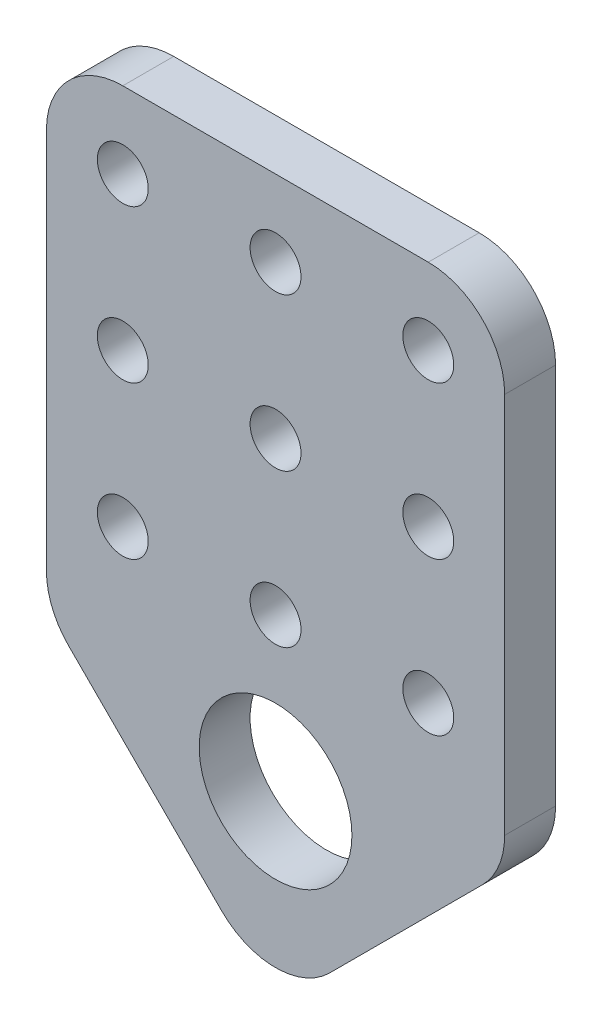
ISO-10303-21;
HEADER;
FILE_DESCRIPTION(('STEP AP214'),'2;1');
FILE_NAME('part.step','',(''),(''),'','','');
FILE_SCHEMA(('AUTOMOTIVE_DESIGN { 1 0 10303 214 1 1 1 1 }'));
ENDSEC;
DATA;
#1=APPLICATION_CONTEXT('core data for automotive mechanical design processes');
#2=APPLICATION_PROTOCOL_DEFINITION('international standard','automotive_design',2000,#1);
#3=PRODUCT_CONTEXT('',#1,'mechanical');
#4=PRODUCT('Part','Part','',(#3));
#5=PRODUCT_RELATED_PRODUCT_CATEGORY('part','',(#4));
#6=PRODUCT_DEFINITION_FORMATION('','',#4);
#7=PRODUCT_DEFINITION_CONTEXT('part definition',#1,'design');
#8=PRODUCT_DEFINITION('design','',#6,#7);
#9=PRODUCT_DEFINITION_SHAPE('','',#8);
#10=(LENGTH_UNIT() NAMED_UNIT(*) SI_UNIT(.MILLI.,.METRE.));
#11=(NAMED_UNIT(*) PLANE_ANGLE_UNIT() SI_UNIT($,.RADIAN.));
#12=(NAMED_UNIT(*) SI_UNIT($,.STERADIAN.) SOLID_ANGLE_UNIT());
#13=UNCERTAINTY_MEASURE_WITH_UNIT(LENGTH_MEASURE(1.E-05),#10,'distance_accuracy_value','');
#14=(GEOMETRIC_REPRESENTATION_CONTEXT(3) GLOBAL_UNCERTAINTY_ASSIGNED_CONTEXT((#13)) GLOBAL_UNIT_ASSIGNED_CONTEXT((#10,
#11,#12)) REPRESENTATION_CONTEXT('',''));
#15=CARTESIAN_POINT('',(0.,0.,0.));
#16=DIRECTION('',(0.,0.,1.));
#17=DIRECTION('',(1.,0.,0.));
#18=AXIS2_PLACEMENT_3D('',#15,#16,#17);
#19=CARTESIAN_POINT('',(0.,226.6787200631,3.));
#20=DIRECTION('',(0.,-1.,0.));
#21=DIRECTION('',(0.,0.,-1.));
#22=AXIS2_PLACEMENT_3D('',#19,#20,#21);
#23=PLANE('',#22);
#24=DIRECTION('',(-1.,0.,0.));
#25=VECTOR('',#24,1.);
#26=CARTESIAN_POINT('',(0.,226.6787200631,0.));
#27=LINE('',#26,#25);
#28=CARTESIAN_POINT('',(196.7270545748,226.6787200631,0.));
#29=VERTEX_POINT('',#28);
#30=CARTESIAN_POINT('',(178.7270545748,226.6787200631,0.));
#31=VERTEX_POINT('',#30);
#32=EDGE_CURVE('E171',#29,#31,#27,.T.);
#33=ORIENTED_EDGE('',*,*,#32,.T.);
#34=DIRECTION('',(0.,0.,-1.));
#35=VECTOR('',#34,1.);
#36=CARTESIAN_POINT('',(178.7270545748,226.6787200631,3.));
#37=LINE('',#36,#35);
#38=CARTESIAN_POINT('',(178.7270545748,226.6787200631,3.));
#39=VERTEX_POINT('',#38);
#40=EDGE_CURVE('E11',#39,#31,#37,.T.);
#41=ORIENTED_EDGE('',*,*,#40,.F.);
#42=DIRECTION('',(-1.,0.,0.));
#43=VECTOR('',#42,1.);
#44=CARTESIAN_POINT('',(0.,226.6787200631,3.));
#45=LINE('',#44,#43);
#46=CARTESIAN_POINT('',(196.7270545748,226.6787200631,3.));
#47=VERTEX_POINT('',#46);
#48=EDGE_CURVE('E230',#47,#39,#45,.T.);
#49=ORIENTED_EDGE('',*,*,#48,.F.);
#50=DIRECTION('',(0.,0.,-1.));
#51=VECTOR('',#50,1.);
#52=CARTESIAN_POINT('',(196.7270545748,226.6787200631,3.));
#53=LINE('',#52,#51);
#54=EDGE_CURVE('E137',#47,#29,#53,.T.);
#55=ORIENTED_EDGE('',*,*,#54,.T.);
#56=EDGE_LOOP('',(#33,#41,#49,#55));
#57=FACE_BOUND('',#56,.T.);
#58=ADVANCED_FACE('F33',(#57),#23,.F.);
#59=CARTESIAN_POINT('',(178.7270545748,222.1787200631,3.));
#60=DIRECTION('',(0.,0.,-1.));
#61=DIRECTION('',(-1.,0.,0.));
#62=AXIS2_PLACEMENT_3D('',#59,#60,#61);
#63=CYLINDRICAL_SURFACE('',#62,4.5);
#64=CARTESIAN_POINT('',(178.7270545748,222.1787200631,0.));
#65=DIRECTION('',(0.,0.,1.));
#66=DIRECTION('',(1.,0.,0.));
#67=AXIS2_PLACEMENT_3D('',#64,#65,#66);
#68=CIRCLE('',#67,4.5);
#69=CARTESIAN_POINT('',(174.2270545748,222.1787200631,0.));
#70=VERTEX_POINT('',#69);
#71=EDGE_CURVE('E174',#31,#70,#68,.T.);
#72=ORIENTED_EDGE('',*,*,#71,.T.);
#73=DIRECTION('',(0.,0.,-1.));
#74=VECTOR('',#73,1.);
#75=CARTESIAN_POINT('',(174.2270545748,222.1787200631,3.));
#76=LINE('',#75,#74);
#77=CARTESIAN_POINT('',(174.2270545748,222.1787200631,3.));
#78=VERTEX_POINT('',#77);
#79=EDGE_CURVE('E42',#78,#70,#76,.T.);
#80=ORIENTED_EDGE('',*,*,#79,.F.);
#81=CARTESIAN_POINT('',(178.7270545748,222.1787200631,3.));
#82=DIRECTION('',(0.,0.,1.));
#83=DIRECTION('',(1.,0.,0.));
#84=AXIS2_PLACEMENT_3D('',#81,#82,#83);
#85=CIRCLE('',#84,4.5);
#86=EDGE_CURVE('E95',#39,#78,#85,.T.);
#87=ORIENTED_EDGE('',*,*,#86,.F.);
#88=ORIENTED_EDGE('',*,*,#40,.T.);
#89=EDGE_LOOP('',(#72,#80,#87,#88));
#90=FACE_BOUND('',#89,.T.);
#91=ADVANCED_FACE('F212',(#90),#63,.T.);
#92=CARTESIAN_POINT('',(174.2270545748,0.,3.));
#93=DIRECTION('',(-1.,0.,0.));
#94=DIRECTION('',(0.,0.,1.));
#95=AXIS2_PLACEMENT_3D('',#92,#93,#94);
#96=PLANE('',#95);
#97=DIRECTION('',(0.,1.,0.));
#98=VECTOR('',#97,1.);
#99=CARTESIAN_POINT('',(174.2270545748,0.,0.));
#100=LINE('',#99,#98);
#101=CARTESIAN_POINT('',(174.2270545748,199.6787200631,0.));
#102=VERTEX_POINT('',#101);
#103=EDGE_CURVE('E177',#102,#70,#100,.T.);
#104=ORIENTED_EDGE('',*,*,#103,.F.);
#105=DIRECTION('',(0.,0.,-1.));
#106=VECTOR('',#105,1.);
#107=CARTESIAN_POINT('',(174.2270545748,199.6787200631,3.));
#108=LINE('',#107,#106);
#109=CARTESIAN_POINT('',(174.2270545748,199.6787200631,3.));
#110=VERTEX_POINT('',#109);
#111=EDGE_CURVE('E205',#110,#102,#108,.T.);
#112=ORIENTED_EDGE('',*,*,#111,.F.);
#113=DIRECTION('',(0.,1.,0.));
#114=VECTOR('',#113,1.);
#115=CARTESIAN_POINT('',(174.2270545748,0.,3.));
#116=LINE('',#115,#114);
#117=EDGE_CURVE('E211',#110,#78,#116,.T.);
#118=ORIENTED_EDGE('',*,*,#117,.T.);
#119=ORIENTED_EDGE('',*,*,#79,.T.);
#120=EDGE_LOOP('',(#104,#112,#118,#119));
#121=FACE_BOUND('',#120,.T.);
#122=ADVANCED_FACE('F209',(#121),#96,.T.);
#123=CARTESIAN_POINT('',(178.7270545748,199.678720062979,3.));
#124=DIRECTION('',(0.,0.,-1.));
#125=DIRECTION('',(-1.,0.,0.));
#126=AXIS2_PLACEMENT_3D('',#123,#124,#125);
#127=CYLINDRICAL_SURFACE('',#126,4.50000000000001);
#128=CARTESIAN_POINT('',(178.7270545748,199.678720062979,0.));
#129=DIRECTION('',(0.,0.,1.));
#130=DIRECTION('',(1.,0.,0.));
#131=AXIS2_PLACEMENT_3D('',#128,#129,#130);
#132=CIRCLE('',#131,4.50000000000001);
#133=CARTESIAN_POINT('',(175.5450740594,196.4967395477,0.));
#134=VERTEX_POINT('',#133);
#135=EDGE_CURVE('E180',#102,#134,#132,.T.);
#136=ORIENTED_EDGE('',*,*,#135,.T.);
#137=DIRECTION('',(0.,0.,-1.));
#138=VECTOR('',#137,1.);
#139=CARTESIAN_POINT('',(175.5450740594,196.4967395477,3.));
#140=LINE('',#139,#138);
#141=CARTESIAN_POINT('',(175.5450740594,196.4967395477,3.));
#142=VERTEX_POINT('',#141);
#143=EDGE_CURVE('E203',#142,#134,#140,.T.);
#144=ORIENTED_EDGE('',*,*,#143,.F.);
#145=CARTESIAN_POINT('',(178.7270545748,199.678720062979,3.));
#146=DIRECTION('',(0.,0.,1.));
#147=DIRECTION('',(1.,0.,0.));
#148=AXIS2_PLACEMENT_3D('',#145,#146,#147);
#149=CIRCLE('',#148,4.50000000000001);
#150=EDGE_CURVE('E225',#110,#142,#149,.T.);
#151=ORIENTED_EDGE('',*,*,#150,.F.);
#152=ORIENTED_EDGE('',*,*,#111,.T.);
#153=EDGE_LOOP('',(#136,#144,#151,#152));
#154=FACE_BOUND('',#153,.T.);
#155=ADVANCED_FACE('F222',(#154),#127,.T.);
#156=CARTESIAN_POINT('',(186.02090680355,186.02090680355,3.));
#157=DIRECTION('',(-0.707106781186546,-0.707106781186548,0.));
#158=DIRECTION('',(0.707106781186549,-0.707106781186546,0.));
#159=AXIS2_PLACEMENT_3D('',#156,#157,#158);
#160=PLANE('',#159);
#161=DIRECTION('',(-0.707106781186549,0.707106781186546,0.));
#162=VECTOR('',#161,1.);
#163=CARTESIAN_POINT('',(186.02090680355,186.02090680355,0.));
#164=LINE('',#163,#162);
#165=CARTESIAN_POINT('',(184.5450740594,187.4967395477,0.));
#166=VERTEX_POINT('',#165);
#167=EDGE_CURVE('E183',#166,#134,#164,.T.);
#168=ORIENTED_EDGE('',*,*,#167,.F.);
#169=DIRECTION('',(0.,0.,-1.));
#170=VECTOR('',#169,1.);
#171=CARTESIAN_POINT('',(184.5450740594,187.4967395477,3.));
#172=LINE('',#171,#170);
#173=CARTESIAN_POINT('',(184.5450740594,187.4967395477,3.));
#174=VERTEX_POINT('',#173);
#175=EDGE_CURVE('E201',#174,#166,#172,.T.);
#176=ORIENTED_EDGE('',*,*,#175,.F.);
#177=DIRECTION('',(-0.707106781186549,0.707106781186546,0.));
#178=VECTOR('',#177,1.);
#179=CARTESIAN_POINT('',(186.02090680355,186.02090680355,3.));
#180=LINE('',#179,#178);
#181=EDGE_CURVE('E227',#174,#142,#180,.T.);
#182=ORIENTED_EDGE('',*,*,#181,.T.);
#183=ORIENTED_EDGE('',*,*,#143,.T.);
#184=EDGE_LOOP('',(#168,#176,#182,#183));
#185=FACE_BOUND('',#184,.T.);
#186=ADVANCED_FACE('F436',(#185),#160,.T.);
#187=CARTESIAN_POINT('',(187.72705457475,190.678720063029,3.));
#188=DIRECTION('',(0.,0.,-1.));
#189=DIRECTION('',(-1.,0.,0.));
#190=AXIS2_PLACEMENT_3D('',#187,#188,#189);
#191=CYLINDRICAL_SURFACE('',#190,4.49999999999998);
#192=CARTESIAN_POINT('',(187.72705457475,190.678720063029,0.));
#193=DIRECTION('',(0.,0.,1.));
#194=DIRECTION('',(1.,0.,0.));
#195=AXIS2_PLACEMENT_3D('',#192,#193,#194);
#196=CIRCLE('',#195,4.49999999999998);
#197=CARTESIAN_POINT('',(190.9090350901,187.4967395477,0.));
#198=VERTEX_POINT('',#197);
#199=EDGE_CURVE('E186',#166,#198,#196,.T.);
#200=ORIENTED_EDGE('',*,*,#199,.T.);
#201=DIRECTION('',(0.,0.,-1.));
#202=VECTOR('',#201,1.);
#203=CARTESIAN_POINT('',(190.9090350901,187.4967395477,3.));
#204=LINE('',#203,#202);
#205=CARTESIAN_POINT('',(190.9090350901,187.4967395477,3.));
#206=VERTEX_POINT('',#205);
#207=EDGE_CURVE('E198',#206,#198,#204,.T.);
#208=ORIENTED_EDGE('',*,*,#207,.F.);
#209=CARTESIAN_POINT('',(187.72705457475,190.678720063029,3.));
#210=DIRECTION('',(0.,0.,1.));
#211=DIRECTION('',(1.,0.,0.));
#212=AXIS2_PLACEMENT_3D('',#209,#210,#211);
#213=CIRCLE('',#212,4.49999999999998);
#214=EDGE_CURVE('E235',#174,#206,#213,.T.);
#215=ORIENTED_EDGE('',*,*,#214,.F.);
#216=ORIENTED_EDGE('',*,*,#175,.T.);
#217=EDGE_LOOP('',(#200,#208,#215,#216));
#218=FACE_BOUND('',#217,.T.);
#219=ADVANCED_FACE('F239',(#218),#191,.T.);
#220=CARTESIAN_POINT('',(1.70614777119971,-1.70614777119971,3.));
#221=DIRECTION('',(-0.707106781186546,0.707106781186548,0.));
#222=DIRECTION('',(-0.707106781186549,-0.707106781186546,0.));
#223=AXIS2_PLACEMENT_3D('',#220,#221,#222);
#224=PLANE('',#223);
#225=DIRECTION('',(0.707106781186549,0.707106781186546,0.));
#226=VECTOR('',#225,1.);
#227=CARTESIAN_POINT('',(1.70614777119971,-1.70614777119971,0.));
#228=LINE('',#227,#226);
#229=CARTESIAN_POINT('',(199.9090350901,196.4967395477,0.));
#230=VERTEX_POINT('',#229);
#231=EDGE_CURVE('E188',#198,#230,#228,.T.);
#232=ORIENTED_EDGE('',*,*,#231,.T.);
#233=DIRECTION('',(0.,0.,-1.));
#234=VECTOR('',#233,1.);
#235=CARTESIAN_POINT('',(199.9090350901,196.4967395477,3.));
#236=LINE('',#235,#234);
#237=CARTESIAN_POINT('',(199.9090350901,196.4967395477,3.));
#238=VERTEX_POINT('',#237);
#239=EDGE_CURVE('E133',#238,#230,#236,.T.);
#240=ORIENTED_EDGE('',*,*,#239,.F.);
#241=DIRECTION('',(0.707106781186549,0.707106781186546,0.));
#242=VECTOR('',#241,1.);
#243=CARTESIAN_POINT('',(1.70614777119971,-1.70614777119971,3.));
#244=LINE('',#243,#242);
#245=EDGE_CURVE('E120',#206,#238,#244,.T.);
#246=ORIENTED_EDGE('',*,*,#245,.F.);
#247=ORIENTED_EDGE('',*,*,#207,.T.);
#248=EDGE_LOOP('',(#232,#240,#246,#247));
#249=FACE_BOUND('',#248,.T.);
#250=ADVANCED_FACE('F242',(#249),#224,.F.);
#251=CARTESIAN_POINT('',(196.7270545748,199.678720063079,3.));
#252=DIRECTION('',(0.,0.,-1.));
#253=DIRECTION('',(-1.,0.,0.));
#254=AXIS2_PLACEMENT_3D('',#251,#252,#253);
#255=CYLINDRICAL_SURFACE('',#254,4.50000000000001);
#256=CARTESIAN_POINT('',(196.7270545748,199.678720063079,0.));
#257=DIRECTION('',(0.,0.,1.));
#258=DIRECTION('',(1.,0.,0.));
#259=AXIS2_PLACEMENT_3D('',#256,#257,#258);
#260=CIRCLE('',#259,4.50000000000001);
#261=CARTESIAN_POINT('',(201.2270545748,199.6787200631,0.));
#262=VERTEX_POINT('',#261);
#263=EDGE_CURVE('E129',#230,#262,#260,.T.);
#264=ORIENTED_EDGE('',*,*,#263,.T.);
#265=DIRECTION('',(0.,0.,-1.));
#266=VECTOR('',#265,1.);
#267=CARTESIAN_POINT('',(201.2270545748,199.6787200631,3.));
#268=LINE('',#267,#266);
#269=CARTESIAN_POINT('',(201.2270545748,199.6787200631,3.));
#270=VERTEX_POINT('',#269);
#271=EDGE_CURVE('E126',#270,#262,#268,.T.);
#272=ORIENTED_EDGE('',*,*,#271,.F.);
#273=CARTESIAN_POINT('',(196.7270545748,199.678720063079,3.));
#274=DIRECTION('',(0.,0.,1.));
#275=DIRECTION('',(1.,0.,0.));
#276=AXIS2_PLACEMENT_3D('',#273,#274,#275);
#277=CIRCLE('',#276,4.50000000000001);
#278=EDGE_CURVE('E114',#238,#270,#277,.T.);
#279=ORIENTED_EDGE('',*,*,#278,.F.);
#280=ORIENTED_EDGE('',*,*,#239,.T.);
#281=EDGE_LOOP('',(#264,#272,#279,#280));
#282=FACE_BOUND('',#281,.T.);
#283=ADVANCED_FACE('F127',(#282),#255,.T.);
#284=CARTESIAN_POINT('',(201.2270545748,0.,3.));
#285=DIRECTION('',(1.,0.,0.));
#286=DIRECTION('',(0.,0.,-1.));
#287=AXIS2_PLACEMENT_3D('',#284,#285,#286);
#288=PLANE('',#287);
#289=DIRECTION('',(0.,-1.,0.));
#290=VECTOR('',#289,1.);
#291=CARTESIAN_POINT('',(201.2270545748,0.,0.));
#292=LINE('',#291,#290);
#293=CARTESIAN_POINT('',(201.2270545748,222.1787200631,0.));
#294=VERTEX_POINT('',#293);
#295=EDGE_CURVE('E191',#294,#262,#292,.T.);
#296=ORIENTED_EDGE('',*,*,#295,.F.);
#297=DIRECTION('',(0.,0.,-1.));
#298=VECTOR('',#297,1.);
#299=CARTESIAN_POINT('',(201.2270545748,222.1787200631,3.));
#300=LINE('',#299,#298);
#301=CARTESIAN_POINT('',(201.2270545748,222.1787200631,3.));
#302=VERTEX_POINT('',#301);
#303=EDGE_CURVE('E84',#302,#294,#300,.T.);
#304=ORIENTED_EDGE('',*,*,#303,.F.);
#305=DIRECTION('',(0.,-1.,0.));
#306=VECTOR('',#305,1.);
#307=CARTESIAN_POINT('',(201.2270545748,0.,3.));
#308=LINE('',#307,#306);
#309=EDGE_CURVE('E118',#302,#270,#308,.T.);
#310=ORIENTED_EDGE('',*,*,#309,.T.);
#311=ORIENTED_EDGE('',*,*,#271,.T.);
#312=EDGE_LOOP('',(#296,#304,#310,#311));
#313=FACE_BOUND('',#312,.T.);
#314=ADVANCED_FACE('F135',(#313),#288,.T.);
#315=CARTESIAN_POINT('',(196.7270545748,222.1787200631,3.));
#316=DIRECTION('',(0.,0.,-1.));
#317=DIRECTION('',(-1.,0.,0.));
#318=AXIS2_PLACEMENT_3D('',#315,#316,#317);
#319=CYLINDRICAL_SURFACE('',#318,1.5);
#320=CARTESIAN_POINT('',(196.7270545748,222.1787200631,3.));
#321=DIRECTION('',(0.,0.,1.));
#322=DIRECTION('',(1.,0.,0.));
#323=AXIS2_PLACEMENT_3D('',#320,#321,#322);
#324=CIRCLE('',#323,1.5);
#325=CARTESIAN_POINT('',(198.2270545748,222.1787200631,3.));
#326=VERTEX_POINT('',#325);
#327=EDGE_CURVE('E507',#326,#326,#324,.T.);
#328=ORIENTED_EDGE('',*,*,#327,.T.);
#329=EDGE_LOOP('',(#328));
#330=FACE_BOUND('',#329,.T.);
#331=CARTESIAN_POINT('',(196.7270545748,222.1787200631,0.));
#332=DIRECTION('',(0.,0.,1.));
#333=DIRECTION('',(1.,0.,0.));
#334=AXIS2_PLACEMENT_3D('',#331,#332,#333);
#335=CIRCLE('',#334,1.5);
#336=CARTESIAN_POINT('',(198.2270545748,222.1787200631,0.));
#337=VERTEX_POINT('',#336);
#338=EDGE_CURVE('E168',#337,#337,#335,.T.);
#339=ORIENTED_EDGE('',*,*,#338,.F.);
#340=EDGE_LOOP('',(#339));
#341=FACE_BOUND('',#340,.T.);
#342=ADVANCED_FACE('F266',(#330,#341),#319,.F.);
#343=CARTESIAN_POINT('',(178.7270545748,222.1787200631,3.));
#344=DIRECTION('',(0.,0.,-1.));
#345=DIRECTION('',(-1.,0.,0.));
#346=AXIS2_PLACEMENT_3D('',#343,#344,#345);
#347=CYLINDRICAL_SURFACE('',#346,1.5);
#348=CARTESIAN_POINT('',(178.7270545748,222.1787200631,3.));
#349=DIRECTION('',(0.,0.,1.));
#350=DIRECTION('',(1.,0.,0.));
#351=AXIS2_PLACEMENT_3D('',#348,#349,#350);
#352=CIRCLE('',#351,1.5);
#353=CARTESIAN_POINT('',(180.2270545748,222.1787200631,3.));
#354=VERTEX_POINT('',#353);
#355=EDGE_CURVE('E504',#354,#354,#352,.T.);
#356=ORIENTED_EDGE('',*,*,#355,.T.);
#357=EDGE_LOOP('',(#356));
#358=FACE_BOUND('',#357,.T.);
#359=CARTESIAN_POINT('',(178.7270545748,222.1787200631,0.));
#360=DIRECTION('',(0.,0.,1.));
#361=DIRECTION('',(1.,0.,0.));
#362=AXIS2_PLACEMENT_3D('',#359,#360,#361);
#363=CIRCLE('',#362,1.5);
#364=CARTESIAN_POINT('',(180.2270545748,222.1787200631,0.));
#365=VERTEX_POINT('',#364);
#366=EDGE_CURVE('E165',#365,#365,#363,.T.);
#367=ORIENTED_EDGE('',*,*,#366,.F.);
#368=EDGE_LOOP('',(#367));
#369=FACE_BOUND('',#368,.T.);
#370=ADVANCED_FACE('F269',(#358,#369),#347,.F.);
#371=CARTESIAN_POINT('',(187.7270545748,222.1787200631,3.));
#372=DIRECTION('',(0.,0.,-1.));
#373=DIRECTION('',(-1.,0.,0.));
#374=AXIS2_PLACEMENT_3D('',#371,#372,#373);
#375=CYLINDRICAL_SURFACE('',#374,1.5);
#376=CARTESIAN_POINT('',(187.7270545748,222.1787200631,3.));
#377=DIRECTION('',(0.,0.,1.));
#378=DIRECTION('',(1.,0.,0.));
#379=AXIS2_PLACEMENT_3D('',#376,#377,#378);
#380=CIRCLE('',#379,1.5);
#381=CARTESIAN_POINT('',(189.2270545748,222.1787200631,3.));
#382=VERTEX_POINT('',#381);
#383=EDGE_CURVE('E501',#382,#382,#380,.T.);
#384=ORIENTED_EDGE('',*,*,#383,.T.);
#385=EDGE_LOOP('',(#384));
#386=FACE_BOUND('',#385,.T.);
#387=CARTESIAN_POINT('',(187.7270545748,222.1787200631,0.));
#388=DIRECTION('',(0.,0.,1.));
#389=DIRECTION('',(1.,0.,0.));
#390=AXIS2_PLACEMENT_3D('',#387,#388,#389);
#391=CIRCLE('',#390,1.5);
#392=CARTESIAN_POINT('',(189.2270545748,222.1787200631,0.));
#393=VERTEX_POINT('',#392);
#394=EDGE_CURVE('E162',#393,#393,#391,.T.);
#395=ORIENTED_EDGE('',*,*,#394,.F.);
#396=EDGE_LOOP('',(#395));
#397=FACE_BOUND('',#396,.T.);
#398=ADVANCED_FACE('F273',(#386,#397),#375,.F.);
#399=CARTESIAN_POINT('',(196.7270545748,204.1787200631,3.));
#400=DIRECTION('',(0.,0.,-1.));
#401=DIRECTION('',(-1.,0.,0.));
#402=AXIS2_PLACEMENT_3D('',#399,#400,#401);
#403=CYLINDRICAL_SURFACE('',#402,1.5);
#404=CARTESIAN_POINT('',(196.7270545748,204.1787200631,3.));
#405=DIRECTION('',(0.,0.,1.));
#406=DIRECTION('',(1.,0.,0.));
#407=AXIS2_PLACEMENT_3D('',#404,#405,#406);
#408=CIRCLE('',#407,1.5);
#409=CARTESIAN_POINT('',(198.2270545748,204.1787200631,3.));
#410=VERTEX_POINT('',#409);
#411=EDGE_CURVE('E498',#410,#410,#408,.T.);
#412=ORIENTED_EDGE('',*,*,#411,.T.);
#413=EDGE_LOOP('',(#412));
#414=FACE_BOUND('',#413,.T.);
#415=CARTESIAN_POINT('',(196.7270545748,204.1787200631,0.));
#416=DIRECTION('',(0.,0.,1.));
#417=DIRECTION('',(1.,0.,0.));
#418=AXIS2_PLACEMENT_3D('',#415,#416,#417);
#419=CIRCLE('',#418,1.5);
#420=CARTESIAN_POINT('',(198.2270545748,204.1787200631,0.));
#421=VERTEX_POINT('',#420);
#422=EDGE_CURVE('E159',#421,#421,#419,.T.);
#423=ORIENTED_EDGE('',*,*,#422,.F.);
#424=EDGE_LOOP('',(#423));
#425=FACE_BOUND('',#424,.T.);
#426=ADVANCED_FACE('F277',(#414,#425),#403,.F.);
#427=CARTESIAN_POINT('',(196.7270545748,213.1787200631,3.));
#428=DIRECTION('',(0.,0.,-1.));
#429=DIRECTION('',(-1.,0.,0.));
#430=AXIS2_PLACEMENT_3D('',#427,#428,#429);
#431=CYLINDRICAL_SURFACE('',#430,1.5);
#432=CARTESIAN_POINT('',(196.7270545748,213.1787200631,3.));
#433=DIRECTION('',(0.,0.,1.));
#434=DIRECTION('',(1.,0.,0.));
#435=AXIS2_PLACEMENT_3D('',#432,#433,#434);
#436=CIRCLE('',#435,1.5);
#437=CARTESIAN_POINT('',(198.2270545748,213.1787200631,3.));
#438=VERTEX_POINT('',#437);
#439=EDGE_CURVE('E495',#438,#438,#436,.T.);
#440=ORIENTED_EDGE('',*,*,#439,.T.);
#441=EDGE_LOOP('',(#440));
#442=FACE_BOUND('',#441,.T.);
#443=CARTESIAN_POINT('',(196.7270545748,213.1787200631,0.));
#444=DIRECTION('',(0.,0.,1.));
#445=DIRECTION('',(1.,0.,0.));
#446=AXIS2_PLACEMENT_3D('',#443,#444,#445);
#447=CIRCLE('',#446,1.5);
#448=CARTESIAN_POINT('',(198.2270545748,213.1787200631,0.));
#449=VERTEX_POINT('',#448);
#450=EDGE_CURVE('E156',#449,#449,#447,.T.);
#451=ORIENTED_EDGE('',*,*,#450,.F.);
#452=EDGE_LOOP('',(#451));
#453=FACE_BOUND('',#452,.T.);
#454=ADVANCED_FACE('F281',(#442,#453),#431,.F.);
#455=CARTESIAN_POINT('',(178.7270545748,213.1787200631,3.));
#456=DIRECTION('',(0.,0.,-1.));
#457=DIRECTION('',(-1.,0.,0.));
#458=AXIS2_PLACEMENT_3D('',#455,#456,#457);
#459=CYLINDRICAL_SURFACE('',#458,1.5);
#460=CARTESIAN_POINT('',(178.7270545748,213.1787200631,3.));
#461=DIRECTION('',(0.,0.,1.));
#462=DIRECTION('',(1.,0.,0.));
#463=AXIS2_PLACEMENT_3D('',#460,#461,#462);
#464=CIRCLE('',#463,1.5);
#465=CARTESIAN_POINT('',(180.2270545748,213.1787200631,3.));
#466=VERTEX_POINT('',#465);
#467=EDGE_CURVE('E492',#466,#466,#464,.T.);
#468=ORIENTED_EDGE('',*,*,#467,.T.);
#469=EDGE_LOOP('',(#468));
#470=FACE_BOUND('',#469,.T.);
#471=CARTESIAN_POINT('',(178.7270545748,213.1787200631,0.));
#472=DIRECTION('',(0.,0.,1.));
#473=DIRECTION('',(1.,0.,0.));
#474=AXIS2_PLACEMENT_3D('',#471,#472,#473);
#475=CIRCLE('',#474,1.5);
#476=CARTESIAN_POINT('',(180.2270545748,213.1787200631,0.));
#477=VERTEX_POINT('',#476);
#478=EDGE_CURVE('E153',#477,#477,#475,.T.);
#479=ORIENTED_EDGE('',*,*,#478,.F.);
#480=EDGE_LOOP('',(#479));
#481=FACE_BOUND('',#480,.T.);
#482=ADVANCED_FACE('F285',(#470,#481),#459,.F.);
#483=CARTESIAN_POINT('',(187.7270545748,213.1787200631,3.));
#484=DIRECTION('',(0.,0.,-1.));
#485=DIRECTION('',(-1.,0.,0.));
#486=AXIS2_PLACEMENT_3D('',#483,#484,#485);
#487=CYLINDRICAL_SURFACE('',#486,1.5);
#488=CARTESIAN_POINT('',(187.7270545748,213.1787200631,3.));
#489=DIRECTION('',(0.,0.,1.));
#490=DIRECTION('',(1.,0.,0.));
#491=AXIS2_PLACEMENT_3D('',#488,#489,#490);
#492=CIRCLE('',#491,1.5);
#493=CARTESIAN_POINT('',(189.2270545748,213.1787200631,3.));
#494=VERTEX_POINT('',#493);
#495=EDGE_CURVE('E485',#494,#494,#492,.T.);
#496=ORIENTED_EDGE('',*,*,#495,.T.);
#497=EDGE_LOOP('',(#496));
#498=FACE_BOUND('',#497,.T.);
#499=CARTESIAN_POINT('',(187.7270545748,213.1787200631,0.));
#500=DIRECTION('',(0.,0.,1.));
#501=DIRECTION('',(1.,0.,0.));
#502=AXIS2_PLACEMENT_3D('',#499,#500,#501);
#503=CIRCLE('',#502,1.5);
#504=CARTESIAN_POINT('',(189.2270545748,213.1787200631,0.));
#505=VERTEX_POINT('',#504);
#506=EDGE_CURVE('E150',#505,#505,#503,.T.);
#507=ORIENTED_EDGE('',*,*,#506,.F.);
#508=EDGE_LOOP('',(#507));
#509=FACE_BOUND('',#508,.T.);
#510=ADVANCED_FACE('F289',(#498,#509),#487,.F.);
#511=CARTESIAN_POINT('',(178.7270545748,204.1787200631,3.));
#512=DIRECTION('',(0.,0.,-1.));
#513=DIRECTION('',(-1.,0.,0.));
#514=AXIS2_PLACEMENT_3D('',#511,#512,#513);
#515=CYLINDRICAL_SURFACE('',#514,1.5);
#516=CARTESIAN_POINT('',(178.7270545748,204.1787200631,3.));
#517=DIRECTION('',(0.,0.,1.));
#518=DIRECTION('',(1.,0.,0.));
#519=AXIS2_PLACEMENT_3D('',#516,#517,#518);
#520=CIRCLE('',#519,1.5);
#521=CARTESIAN_POINT('',(180.2270545748,204.1787200631,3.));
#522=VERTEX_POINT('',#521);
#523=EDGE_CURVE('E482',#522,#522,#520,.T.);
#524=ORIENTED_EDGE('',*,*,#523,.T.);
#525=EDGE_LOOP('',(#524));
#526=FACE_BOUND('',#525,.T.);
#527=CARTESIAN_POINT('',(178.7270545748,204.1787200631,0.));
#528=DIRECTION('',(0.,0.,1.));
#529=DIRECTION('',(1.,0.,0.));
#530=AXIS2_PLACEMENT_3D('',#527,#528,#529);
#531=CIRCLE('',#530,1.5);
#532=CARTESIAN_POINT('',(180.2270545748,204.1787200631,0.));
#533=VERTEX_POINT('',#532);
#534=EDGE_CURVE('E147',#533,#533,#531,.T.);
#535=ORIENTED_EDGE('',*,*,#534,.F.);
#536=EDGE_LOOP('',(#535));
#537=FACE_BOUND('',#536,.T.);
#538=ADVANCED_FACE('F293',(#526,#537),#515,.F.);
#539=CARTESIAN_POINT('',(187.7270545748,204.1787200631,3.));
#540=DIRECTION('',(0.,0.,-1.));
#541=DIRECTION('',(-1.,0.,0.));
#542=AXIS2_PLACEMENT_3D('',#539,#540,#541);
#543=CYLINDRICAL_SURFACE('',#542,1.5);
#544=CARTESIAN_POINT('',(187.7270545748,204.1787200631,3.));
#545=DIRECTION('',(0.,0.,1.));
#546=DIRECTION('',(1.,0.,0.));
#547=AXIS2_PLACEMENT_3D('',#544,#545,#546);
#548=CIRCLE('',#547,1.5);
#549=CARTESIAN_POINT('',(189.2270545748,204.1787200631,3.));
#550=VERTEX_POINT('',#549);
#551=EDGE_CURVE('E304',#550,#550,#548,.T.);
#552=ORIENTED_EDGE('',*,*,#551,.T.);
#553=EDGE_LOOP('',(#552));
#554=FACE_BOUND('',#553,.T.);
#555=CARTESIAN_POINT('',(187.7270545748,204.1787200631,0.));
#556=DIRECTION('',(0.,0.,1.));
#557=DIRECTION('',(1.,0.,0.));
#558=AXIS2_PLACEMENT_3D('',#555,#556,#557);
#559=CIRCLE('',#558,1.5);
#560=CARTESIAN_POINT('',(189.2270545748,204.1787200631,0.));
#561=VERTEX_POINT('',#560);
#562=EDGE_CURVE('E144',#561,#561,#559,.T.);
#563=ORIENTED_EDGE('',*,*,#562,.F.);
#564=EDGE_LOOP('',(#563));
#565=FACE_BOUND('',#564,.T.);
#566=ADVANCED_FACE('F254',(#554,#565),#543,.F.);
#567=CARTESIAN_POINT('',(187.7270545748,195.1787200631,3.));
#568=DIRECTION('',(0.,0.,-1.));
#569=DIRECTION('',(-1.,0.,0.));
#570=AXIS2_PLACEMENT_3D('',#567,#568,#569);
#571=CYLINDRICAL_SURFACE('',#570,4.5);
#572=CARTESIAN_POINT('',(187.7270545748,195.1787200631,3.));
#573=DIRECTION('',(0.,0.,1.));
#574=DIRECTION('',(1.,0.,0.));
#575=AXIS2_PLACEMENT_3D('',#572,#573,#574);
#576=CIRCLE('',#575,4.5);
#577=CARTESIAN_POINT('',(192.2270545748,195.1787200631,3.));
#578=VERTEX_POINT('',#577);
#579=EDGE_CURVE('E194',#578,#578,#576,.T.);
#580=ORIENTED_EDGE('',*,*,#579,.T.);
#581=EDGE_LOOP('',(#580));
#582=FACE_BOUND('',#581,.T.);
#583=CARTESIAN_POINT('',(187.7270545748,195.1787200631,0.));
#584=DIRECTION('',(0.,0.,1.));
#585=DIRECTION('',(1.,0.,0.));
#586=AXIS2_PLACEMENT_3D('',#583,#584,#585);
#587=CIRCLE('',#586,4.5);
#588=CARTESIAN_POINT('',(192.2270545748,195.1787200631,0.));
#589=VERTEX_POINT('',#588);
#590=EDGE_CURVE('E141',#589,#589,#587,.T.);
#591=ORIENTED_EDGE('',*,*,#590,.F.);
#592=EDGE_LOOP('',(#591));
#593=FACE_BOUND('',#592,.T.);
#594=ADVANCED_FACE('F35',(#582,#593),#571,.F.);
#595=CARTESIAN_POINT('',(196.7270545748,222.1787200631,3.));
#596=DIRECTION('',(0.,0.,-1.));
#597=DIRECTION('',(-1.,0.,0.));
#598=AXIS2_PLACEMENT_3D('',#595,#596,#597);
#599=CYLINDRICAL_SURFACE('',#598,4.5);
#600=CARTESIAN_POINT('',(196.7270545748,222.1787200631,0.));
#601=DIRECTION('',(0.,0.,1.));
#602=DIRECTION('',(1.,0.,0.));
#603=AXIS2_PLACEMENT_3D('',#600,#601,#602);
#604=CIRCLE('',#603,4.5);
#605=EDGE_CURVE('E87',#294,#29,#604,.T.);
#606=ORIENTED_EDGE('',*,*,#605,.T.);
#607=ORIENTED_EDGE('',*,*,#54,.F.);
#608=CARTESIAN_POINT('',(196.7270545748,222.1787200631,3.));
#609=DIRECTION('',(0.,0.,1.));
#610=DIRECTION('',(1.,0.,0.));
#611=AXIS2_PLACEMENT_3D('',#608,#609,#610);
#612=CIRCLE('',#611,4.5);
#613=EDGE_CURVE('E50',#302,#47,#612,.T.);
#614=ORIENTED_EDGE('',*,*,#613,.F.);
#615=ORIENTED_EDGE('',*,*,#303,.T.);
#616=EDGE_LOOP('',(#606,#607,#614,#615));
#617=FACE_BOUND('',#616,.T.);
#618=ADVANCED_FACE('F245',(#617),#599,.T.);
#619=CARTESIAN_POINT('',(0.,0.,3.));
#620=DIRECTION('',(0.,0.,1.));
#621=DIRECTION('',(1.,0.,0.));
#622=AXIS2_PLACEMENT_3D('',#619,#620,#621);
#623=PLANE('',#622);
#624=ORIENTED_EDGE('',*,*,#579,.F.);
#625=EDGE_LOOP('',(#624));
#626=FACE_BOUND('',#625,.T.);
#627=ORIENTED_EDGE('',*,*,#551,.F.);
#628=EDGE_LOOP('',(#627));
#629=FACE_BOUND('',#628,.T.);
#630=ORIENTED_EDGE('',*,*,#523,.F.);
#631=EDGE_LOOP('',(#630));
#632=FACE_BOUND('',#631,.T.);
#633=ORIENTED_EDGE('',*,*,#495,.F.);
#634=EDGE_LOOP('',(#633));
#635=FACE_BOUND('',#634,.T.);
#636=ORIENTED_EDGE('',*,*,#467,.F.);
#637=EDGE_LOOP('',(#636));
#638=FACE_BOUND('',#637,.T.);
#639=ORIENTED_EDGE('',*,*,#439,.F.);
#640=EDGE_LOOP('',(#639));
#641=FACE_BOUND('',#640,.T.);
#642=ORIENTED_EDGE('',*,*,#411,.F.);
#643=EDGE_LOOP('',(#642));
#644=FACE_BOUND('',#643,.T.);
#645=ORIENTED_EDGE('',*,*,#383,.F.);
#646=EDGE_LOOP('',(#645));
#647=FACE_BOUND('',#646,.T.);
#648=ORIENTED_EDGE('',*,*,#355,.F.);
#649=EDGE_LOOP('',(#648));
#650=FACE_BOUND('',#649,.T.);
#651=ORIENTED_EDGE('',*,*,#327,.F.);
#652=EDGE_LOOP('',(#651));
#653=FACE_BOUND('',#652,.T.);
#654=ORIENTED_EDGE('',*,*,#48,.T.);
#655=ORIENTED_EDGE('',*,*,#86,.T.);
#656=ORIENTED_EDGE('',*,*,#117,.F.);
#657=ORIENTED_EDGE('',*,*,#150,.T.);
#658=ORIENTED_EDGE('',*,*,#181,.F.);
#659=ORIENTED_EDGE('',*,*,#214,.T.);
#660=ORIENTED_EDGE('',*,*,#245,.T.);
#661=ORIENTED_EDGE('',*,*,#278,.T.);
#662=ORIENTED_EDGE('',*,*,#309,.F.);
#663=ORIENTED_EDGE('',*,*,#613,.T.);
#664=EDGE_LOOP('',(#654,#655,#656,#657,#658,#659,#660,#661,#662,#663));
#665=FACE_BOUND('',#664,.T.);
#666=ADVANCED_FACE('F116',(#626,#629,#632,#635,#638,#641,#644,#647,#650,#653,#665),#623,.T.);
#667=CARTESIAN_POINT('',(0.,0.,0.));
#668=DIRECTION('',(0.,0.,1.));
#669=DIRECTION('',(1.,0.,0.));
#670=AXIS2_PLACEMENT_3D('',#667,#668,#669);
#671=PLANE('',#670);
#672=ORIENTED_EDGE('',*,*,#590,.T.);
#673=EDGE_LOOP('',(#672));
#674=FACE_BOUND('',#673,.T.);
#675=ORIENTED_EDGE('',*,*,#562,.T.);
#676=EDGE_LOOP('',(#675));
#677=FACE_BOUND('',#676,.T.);
#678=ORIENTED_EDGE('',*,*,#534,.T.);
#679=EDGE_LOOP('',(#678));
#680=FACE_BOUND('',#679,.T.);
#681=ORIENTED_EDGE('',*,*,#506,.T.);
#682=EDGE_LOOP('',(#681));
#683=FACE_BOUND('',#682,.T.);
#684=ORIENTED_EDGE('',*,*,#478,.T.);
#685=EDGE_LOOP('',(#684));
#686=FACE_BOUND('',#685,.T.);
#687=ORIENTED_EDGE('',*,*,#450,.T.);
#688=EDGE_LOOP('',(#687));
#689=FACE_BOUND('',#688,.T.);
#690=ORIENTED_EDGE('',*,*,#422,.T.);
#691=EDGE_LOOP('',(#690));
#692=FACE_BOUND('',#691,.T.);
#693=ORIENTED_EDGE('',*,*,#394,.T.);
#694=EDGE_LOOP('',(#693));
#695=FACE_BOUND('',#694,.T.);
#696=ORIENTED_EDGE('',*,*,#366,.T.);
#697=EDGE_LOOP('',(#696));
#698=FACE_BOUND('',#697,.T.);
#699=ORIENTED_EDGE('',*,*,#338,.T.);
#700=EDGE_LOOP('',(#699));
#701=FACE_BOUND('',#700,.T.);
#702=ORIENTED_EDGE('',*,*,#32,.F.);
#703=ORIENTED_EDGE('',*,*,#605,.F.);
#704=ORIENTED_EDGE('',*,*,#295,.T.);
#705=ORIENTED_EDGE('',*,*,#263,.F.);
#706=ORIENTED_EDGE('',*,*,#231,.F.);
#707=ORIENTED_EDGE('',*,*,#199,.F.);
#708=ORIENTED_EDGE('',*,*,#167,.T.);
#709=ORIENTED_EDGE('',*,*,#135,.F.);
#710=ORIENTED_EDGE('',*,*,#103,.T.);
#711=ORIENTED_EDGE('',*,*,#71,.F.);
#712=EDGE_LOOP('',(#702,#703,#704,#705,#706,#707,#708,#709,#710,#711));
#713=FACE_BOUND('',#712,.T.);
#714=ADVANCED_FACE('F217',(#674,#677,#680,#683,#686,#689,#692,#695,#698,#701,#713),#671,.F.);
#715=CLOSED_SHELL('',(#58,#91,#122,#155,#186,#219,#250,#283,#314,#342,#370,#398,#426,#454,#482,
#510,#538,#566,#594,#618,#666,#714));
#716=MANIFOLD_SOLID_BREP('B2',#715);
#717=ADVANCED_BREP_SHAPE_REPRESENTATION('',(#18,#716),#14);
#718=SHAPE_DEFINITION_REPRESENTATION(#9,#717);
ENDSEC;
END-ISO-10303-21;
